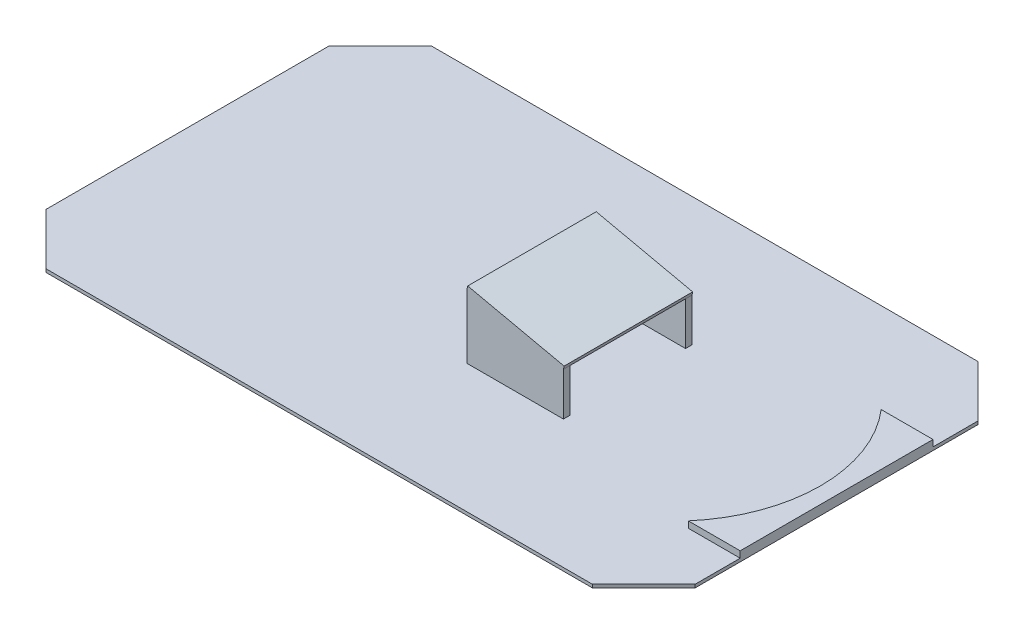
ISO-10303-21;
HEADER;
FILE_DESCRIPTION(('STEP AP214'),'2;1');
FILE_NAME('part.step','',(''),(''),'','','');
FILE_SCHEMA(('AUTOMOTIVE_DESIGN { 1 0 10303 214 1 1 1 1 }'));
ENDSEC;
DATA;
#1=APPLICATION_CONTEXT('core data for automotive mechanical design processes');
#2=APPLICATION_PROTOCOL_DEFINITION('international standard','automotive_design',2000,#1);
#3=PRODUCT_CONTEXT('',#1,'mechanical');
#4=PRODUCT('Part','Part','',(#3));
#5=PRODUCT_RELATED_PRODUCT_CATEGORY('part','',(#4));
#6=PRODUCT_DEFINITION_FORMATION('','',#4);
#7=PRODUCT_DEFINITION_CONTEXT('part definition',#1,'design');
#8=PRODUCT_DEFINITION('design','',#6,#7);
#9=PRODUCT_DEFINITION_SHAPE('','',#8);
#10=(LENGTH_UNIT() NAMED_UNIT(*) SI_UNIT(.MILLI.,.METRE.));
#11=(NAMED_UNIT(*) PLANE_ANGLE_UNIT() SI_UNIT($,.RADIAN.));
#12=(NAMED_UNIT(*) SI_UNIT($,.STERADIAN.) SOLID_ANGLE_UNIT());
#13=UNCERTAINTY_MEASURE_WITH_UNIT(LENGTH_MEASURE(1.E-05),#10,'distance_accuracy_value','');
#14=(GEOMETRIC_REPRESENTATION_CONTEXT(3) GLOBAL_UNCERTAINTY_ASSIGNED_CONTEXT((#13)) GLOBAL_UNIT_ASSIGNED_CONTEXT((#10,
#11,#12)) REPRESENTATION_CONTEXT('',''));
#15=CARTESIAN_POINT('',(0.,0.,0.));
#16=DIRECTION('',(0.,0.,1.));
#17=DIRECTION('',(1.,0.,0.));
#18=AXIS2_PLACEMENT_3D('',#15,#16,#17);
#19=CARTESIAN_POINT('',(0.,5.,0.));
#20=DIRECTION('',(0.,-1.,0.));
#21=DIRECTION('',(0.,0.,-1.));
#22=AXIS2_PLACEMENT_3D('',#19,#20,#21);
#23=PLANE('',#22);
#24=DIRECTION('',(-1.,0.,0.));
#25=VECTOR('',#24,1.);
#26=CARTESIAN_POINT('',(100.,5.,-100.));
#27=LINE('',#26,#25);
#28=CARTESIAN_POINT('',(180.,5.,-100.));
#29=VERTEX_POINT('',#28);
#30=CARTESIAN_POINT('',(30.,5.,-100.));
#31=VERTEX_POINT('',#30);
#32=EDGE_CURVE('E316',#29,#31,#27,.T.);
#33=ORIENTED_EDGE('',*,*,#32,.F.);
#34=DIRECTION('',(0.,0.,-1.));
#35=VECTOR('',#34,1.);
#36=CARTESIAN_POINT('',(180.,5.,-100.));
#37=LINE('',#36,#35);
#38=CARTESIAN_POINT('',(180.,5.,-90.));
#39=VERTEX_POINT('',#38);
#40=EDGE_CURVE('E320',#39,#29,#37,.T.);
#41=ORIENTED_EDGE('',*,*,#40,.F.);
#42=DIRECTION('',(1.,0.,0.));
#43=VECTOR('',#42,1.);
#44=CARTESIAN_POINT('',(180.,5.,-90.));
#45=LINE('',#44,#43);
#46=CARTESIAN_POINT('',(30.,5.,-90.));
#47=VERTEX_POINT('',#46);
#48=EDGE_CURVE('E326',#47,#39,#45,.T.);
#49=ORIENTED_EDGE('',*,*,#48,.F.);
#50=DIRECTION('',(0.,0.,1.));
#51=VECTOR('',#50,1.);
#52=CARTESIAN_POINT('',(30.,5.,-90.));
#53=LINE('',#52,#51);
#54=EDGE_CURVE('E323',#31,#47,#53,.T.);
#55=ORIENTED_EDGE('',*,*,#54,.F.);
#56=EDGE_LOOP('',(#33,#41,#49,#55));
#57=FACE_BOUND('',#56,.T.);
#58=DIRECTION('',(1.,0.,0.));
#59=VECTOR('',#58,1.);
#60=CARTESIAN_POINT('',(90.,5.,10.));
#61=LINE('',#60,#59);
#62=CARTESIAN_POINT('',(90.,5.,10.));
#63=VERTEX_POINT('',#62);
#64=CARTESIAN_POINT('',(110.,5.,10.));
#65=VERTEX_POINT('',#64);
#66=EDGE_CURVE('E430',#63,#65,#61,.T.);
#67=ORIENTED_EDGE('',*,*,#66,.F.);
#68=DIRECTION('',(0.,0.,1.));
#69=VECTOR('',#68,1.);
#70=CARTESIAN_POINT('',(90.,5.,0.));
#71=LINE('',#70,#69);
#72=CARTESIAN_POINT('',(90.,5.,-10.));
#73=VERTEX_POINT('',#72);
#74=EDGE_CURVE('E435',#73,#63,#71,.T.);
#75=ORIENTED_EDGE('',*,*,#74,.F.);
#76=DIRECTION('',(-1.,0.,0.));
#77=VECTOR('',#76,1.);
#78=CARTESIAN_POINT('',(90.,5.,-10.));
#79=LINE('',#78,#77);
#80=CARTESIAN_POINT('',(110.,5.,-10.));
#81=VERTEX_POINT('',#80);
#82=EDGE_CURVE('E450',#81,#73,#79,.T.);
#83=ORIENTED_EDGE('',*,*,#82,.F.);
#84=DIRECTION('',(0.,0.,-1.));
#85=VECTOR('',#84,1.);
#86=CARTESIAN_POINT('',(110.,5.,-10.));
#87=LINE('',#86,#85);
#88=EDGE_CURVE('E447',#65,#81,#87,.T.);
#89=ORIENTED_EDGE('',*,*,#88,.F.);
#90=EDGE_LOOP('',(#67,#75,#83,#89));
#91=FACE_BOUND('',#90,.T.);
#92=DIRECTION('',(-1.,0.,0.));
#93=VECTOR('',#92,1.);
#94=CARTESIAN_POINT('',(424.355957741627,5.,-150.));
#95=LINE('',#94,#93);
#96=CARTESIAN_POINT('',(505.,5.,-150.));
#97=VERTEX_POINT('',#96);
#98=CARTESIAN_POINT('',(424.355957741627,5.,-150.));
#99=VERTEX_POINT('',#98);
#100=EDGE_CURVE('E340',#97,#99,#95,.T.);
#101=ORIENTED_EDGE('',*,*,#100,.F.);
#102=DIRECTION('',(0.,0.,-1.));
#103=VECTOR('',#102,1.);
#104=CARTESIAN_POINT('',(505.,5.,9.99999999999549));
#105=LINE('',#104,#103);
#106=CARTESIAN_POINT('',(505.,5.,-220.));
#107=VERTEX_POINT('',#106);
#108=EDGE_CURVE('E483',#97,#107,#105,.T.);
#109=ORIENTED_EDGE('',*,*,#108,.T.);
#110=DIRECTION('',(-0.707106781186548,0.,-0.707106781186548));
#111=VECTOR('',#110,1.);
#112=CARTESIAN_POINT('',(425.,5.,-300.));
#113=LINE('',#112,#111);
#114=CARTESIAN_POINT('',(425.,5.,-300.));
#115=VERTEX_POINT('',#114);
#116=EDGE_CURVE('E467',#107,#115,#113,.T.);
#117=ORIENTED_EDGE('',*,*,#116,.T.);
#118=DIRECTION('',(-1.,0.,0.));
#119=VECTOR('',#118,1.);
#120=CARTESIAN_POINT('',(-425.,5.,-300.));
#121=LINE('',#120,#119);
#122=CARTESIAN_POINT('',(-425.,5.,-300.));
#123=VERTEX_POINT('',#122);
#124=EDGE_CURVE('E470',#115,#123,#121,.T.);
#125=ORIENTED_EDGE('',*,*,#124,.T.);
#126=DIRECTION('',(-0.707106781186548,0.,0.707106781186547));
#127=VECTOR('',#126,1.);
#128=CARTESIAN_POINT('',(-505.,5.,-220.));
#129=LINE('',#128,#127);
#130=CARTESIAN_POINT('',(-505.,5.,-220.));
#131=VERTEX_POINT('',#130);
#132=EDGE_CURVE('E473',#123,#131,#129,.T.);
#133=ORIENTED_EDGE('',*,*,#132,.T.);
#134=DIRECTION('',(0.,0.,1.));
#135=VECTOR('',#134,1.);
#136=CARTESIAN_POINT('',(-505.,5.,50.));
#137=LINE('',#136,#135);
#138=CARTESIAN_POINT('',(-505.,5.,220.));
#139=VERTEX_POINT('',#138);
#140=EDGE_CURVE('E475',#131,#139,#137,.T.);
#141=ORIENTED_EDGE('',*,*,#140,.T.);
#142=DIRECTION('',(0.707106781186548,0.,0.707106781186547));
#143=VECTOR('',#142,1.);
#144=CARTESIAN_POINT('',(-505.,5.,220.));
#145=LINE('',#144,#143);
#146=CARTESIAN_POINT('',(-425.,5.,300.));
#147=VERTEX_POINT('',#146);
#148=EDGE_CURVE('E477',#139,#147,#145,.T.);
#149=ORIENTED_EDGE('',*,*,#148,.T.);
#150=DIRECTION('',(1.,0.,0.));
#151=VECTOR('',#150,1.);
#152=CARTESIAN_POINT('',(425.,5.,300.));
#153=LINE('',#152,#151);
#154=CARTESIAN_POINT('',(425.,5.,300.));
#155=VERTEX_POINT('',#154);
#156=EDGE_CURVE('E479',#147,#155,#153,.T.);
#157=ORIENTED_EDGE('',*,*,#156,.T.);
#158=DIRECTION('',(0.707106781186546,0.,-0.707106781186548));
#159=VECTOR('',#158,1.);
#160=CARTESIAN_POINT('',(505.,5.,220.));
#161=LINE('',#160,#159);
#162=CARTESIAN_POINT('',(505.,5.,220.));
#163=VERTEX_POINT('',#162);
#164=EDGE_CURVE('E481',#155,#163,#161,.T.);
#165=ORIENTED_EDGE('',*,*,#164,.T.);
#166=CARTESIAN_POINT('',(505.,5.,150.));
#167=VERTEX_POINT('',#166);
#168=EDGE_CURVE('E484',#163,#167,#105,.T.);
#169=ORIENTED_EDGE('',*,*,#168,.T.);
#170=DIRECTION('',(1.,0.,0.));
#171=VECTOR('',#170,1.);
#172=CARTESIAN_POINT('',(424.355957741627,5.,150.));
#173=LINE('',#172,#171);
#174=CARTESIAN_POINT('',(424.355957741627,5.,150.));
#175=VERTEX_POINT('',#174);
#176=EDGE_CURVE('E344',#175,#167,#173,.T.);
#177=ORIENTED_EDGE('',*,*,#176,.F.);
#178=CARTESIAN_POINT('',(250.,5.,0.));
#179=DIRECTION('',(0.,-1.,0.));
#180=DIRECTION('',(0.,0.,1.));
#181=AXIS2_PLACEMENT_3D('',#178,#179,#180);
#182=CIRCLE('',#181,230.);
#183=EDGE_CURVE('E353',#99,#175,#182,.T.);
#184=ORIENTED_EDGE('',*,*,#183,.F.);
#185=EDGE_LOOP('',(#101,#109,#117,#125,#133,#141,#149,#157,#165,#169,#177,#184));
#186=FACE_BOUND('',#185,.T.);
#187=DIRECTION('',(-1.,0.,0.));
#188=VECTOR('',#187,1.);
#189=CARTESIAN_POINT('',(30.,5.,90.));
#190=LINE('',#189,#188);
#191=CARTESIAN_POINT('',(180.,5.,90.));
#192=VERTEX_POINT('',#191);
#193=CARTESIAN_POINT('',(30.,5.,90.));
#194=VERTEX_POINT('',#193);
#195=EDGE_CURVE('E299',#192,#194,#190,.T.);
#196=ORIENTED_EDGE('',*,*,#195,.F.);
#197=DIRECTION('',(0.,0.,-1.));
#198=VECTOR('',#197,1.);
#199=CARTESIAN_POINT('',(180.,5.,90.));
#200=LINE('',#199,#198);
#201=CARTESIAN_POINT('',(180.,5.,100.));
#202=VERTEX_POINT('',#201);
#203=EDGE_CURVE('E302',#202,#192,#200,.T.);
#204=ORIENTED_EDGE('',*,*,#203,.F.);
#205=DIRECTION('',(1.,0.,0.));
#206=VECTOR('',#205,1.);
#207=CARTESIAN_POINT('',(180.,5.,100.));
#208=LINE('',#207,#206);
#209=CARTESIAN_POINT('',(30.,5.,100.));
#210=VERTEX_POINT('',#209);
#211=EDGE_CURVE('E56',#210,#202,#208,.T.);
#212=ORIENTED_EDGE('',*,*,#211,.F.);
#213=DIRECTION('',(0.,0.,1.));
#214=VECTOR('',#213,1.);
#215=CARTESIAN_POINT('',(30.,5.,90.));
#216=LINE('',#215,#214);
#217=EDGE_CURVE('E51',#194,#210,#216,.T.);
#218=ORIENTED_EDGE('',*,*,#217,.F.);
#219=EDGE_LOOP('',(#196,#204,#212,#218));
#220=FACE_BOUND('',#219,.T.);
#221=ADVANCED_FACE('F36',(#57,#91,#186,#220),#23,.F.);
#222=CARTESIAN_POINT('',(425.,5.,-300.));
#223=DIRECTION('',(-0.707106781186548,0.,0.707106781186548));
#224=DIRECTION('',(0.707106781186548,0.,0.707106781186548));
#225=AXIS2_PLACEMENT_3D('',#222,#223,#224);
#226=PLANE('',#225);
#227=DIRECTION('',(-0.707106781186548,0.,-0.707106781186548));
#228=VECTOR('',#227,1.);
#229=CARTESIAN_POINT('',(425.,0.,-300.));
#230=LINE('',#229,#228);
#231=CARTESIAN_POINT('',(505.,0.,-220.));
#232=VERTEX_POINT('',#231);
#233=CARTESIAN_POINT('',(425.,0.,-300.));
#234=VERTEX_POINT('',#233);
#235=EDGE_CURVE('E466',#232,#234,#230,.T.);
#236=ORIENTED_EDGE('',*,*,#235,.T.);
#237=DIRECTION('',(0.,-1.,0.));
#238=VECTOR('',#237,1.);
#239=CARTESIAN_POINT('',(425.,5.,-300.));
#240=LINE('',#239,#238);
#241=EDGE_CURVE('E11',#115,#234,#240,.T.);
#242=ORIENTED_EDGE('',*,*,#241,.F.);
#243=ORIENTED_EDGE('',*,*,#116,.F.);
#244=DIRECTION('',(0.,-1.,0.));
#245=VECTOR('',#244,1.);
#246=CARTESIAN_POINT('',(505.,5.,-220.));
#247=LINE('',#246,#245);
#248=EDGE_CURVE('E486',#107,#232,#247,.T.);
#249=ORIENTED_EDGE('',*,*,#248,.T.);
#250=EDGE_LOOP('',(#236,#242,#243,#249));
#251=FACE_BOUND('',#250,.T.);
#252=ADVANCED_FACE('F38',(#251),#226,.F.);
#253=CARTESIAN_POINT('',(-425.,5.,-300.));
#254=DIRECTION('',(0.,0.,1.));
#255=DIRECTION('',(1.,0.,0.));
#256=AXIS2_PLACEMENT_3D('',#253,#254,#255);
#257=PLANE('',#256);
#258=DIRECTION('',(-1.,0.,0.));
#259=VECTOR('',#258,1.);
#260=CARTESIAN_POINT('',(-425.,0.,-300.));
#261=LINE('',#260,#259);
#262=CARTESIAN_POINT('',(-425.,0.,-300.));
#263=VERTEX_POINT('',#262);
#264=EDGE_CURVE('E489',#234,#263,#261,.T.);
#265=ORIENTED_EDGE('',*,*,#264,.T.);
#266=DIRECTION('',(0.,-1.,0.));
#267=VECTOR('',#266,1.);
#268=CARTESIAN_POINT('',(-425.,5.,-300.));
#269=LINE('',#268,#267);
#270=EDGE_CURVE('E44',#123,#263,#269,.T.);
#271=ORIENTED_EDGE('',*,*,#270,.F.);
#272=ORIENTED_EDGE('',*,*,#124,.F.);
#273=ORIENTED_EDGE('',*,*,#241,.T.);
#274=EDGE_LOOP('',(#265,#271,#272,#273));
#275=FACE_BOUND('',#274,.T.);
#276=ADVANCED_FACE('F547',(#275),#257,.F.);
#277=CARTESIAN_POINT('',(-505.,5.,-220.));
#278=DIRECTION('',(0.707106781186547,0.,0.707106781186548));
#279=DIRECTION('',(0.707106781186548,0.,-0.707106781186547));
#280=AXIS2_PLACEMENT_3D('',#277,#278,#279);
#281=PLANE('',#280);
#282=DIRECTION('',(-0.707106781186548,0.,0.707106781186547));
#283=VECTOR('',#282,1.);
#284=CARTESIAN_POINT('',(-505.,0.,-220.));
#285=LINE('',#284,#283);
#286=CARTESIAN_POINT('',(-505.,0.,-220.));
#287=VERTEX_POINT('',#286);
#288=EDGE_CURVE('E491',#263,#287,#285,.T.);
#289=ORIENTED_EDGE('',*,*,#288,.T.);
#290=DIRECTION('',(0.,-1.,0.));
#291=VECTOR('',#290,1.);
#292=CARTESIAN_POINT('',(-505.,5.,-220.));
#293=LINE('',#292,#291);
#294=EDGE_CURVE('E518',#131,#287,#293,.T.);
#295=ORIENTED_EDGE('',*,*,#294,.F.);
#296=ORIENTED_EDGE('',*,*,#132,.F.);
#297=ORIENTED_EDGE('',*,*,#270,.T.);
#298=EDGE_LOOP('',(#289,#295,#296,#297));
#299=FACE_BOUND('',#298,.T.);
#300=ADVANCED_FACE('F525',(#299),#281,.F.);
#301=CARTESIAN_POINT('',(-505.,5.,50.));
#302=DIRECTION('',(1.,0.,0.));
#303=DIRECTION('',(0.,0.,-1.));
#304=AXIS2_PLACEMENT_3D('',#301,#302,#303);
#305=PLANE('',#304);
#306=DIRECTION('',(0.,0.,1.));
#307=VECTOR('',#306,1.);
#308=CARTESIAN_POINT('',(-505.,0.,50.));
#309=LINE('',#308,#307);
#310=CARTESIAN_POINT('',(-505.,0.,220.));
#311=VERTEX_POINT('',#310);
#312=EDGE_CURVE('E494',#287,#311,#309,.T.);
#313=ORIENTED_EDGE('',*,*,#312,.T.);
#314=DIRECTION('',(0.,-1.,0.));
#315=VECTOR('',#314,1.);
#316=CARTESIAN_POINT('',(-505.,5.,220.));
#317=LINE('',#316,#315);
#318=EDGE_CURVE('E515',#139,#311,#317,.T.);
#319=ORIENTED_EDGE('',*,*,#318,.F.);
#320=ORIENTED_EDGE('',*,*,#140,.F.);
#321=ORIENTED_EDGE('',*,*,#294,.T.);
#322=EDGE_LOOP('',(#313,#319,#320,#321));
#323=FACE_BOUND('',#322,.T.);
#324=ADVANCED_FACE('F535',(#323),#305,.F.);
#325=CARTESIAN_POINT('',(-505.,5.,220.));
#326=DIRECTION('',(0.707106781186547,0.,-0.707106781186548));
#327=DIRECTION('',(-0.707106781186548,0.,-0.707106781186547));
#328=AXIS2_PLACEMENT_3D('',#325,#326,#327);
#329=PLANE('',#328);
#330=DIRECTION('',(0.707106781186548,0.,0.707106781186547));
#331=VECTOR('',#330,1.);
#332=CARTESIAN_POINT('',(-505.,0.,220.));
#333=LINE('',#332,#331);
#334=CARTESIAN_POINT('',(-425.,0.,300.));
#335=VERTEX_POINT('',#334);
#336=EDGE_CURVE('E496',#311,#335,#333,.T.);
#337=ORIENTED_EDGE('',*,*,#336,.T.);
#338=DIRECTION('',(0.,-1.,0.));
#339=VECTOR('',#338,1.);
#340=CARTESIAN_POINT('',(-425.,5.,300.));
#341=LINE('',#340,#339);
#342=EDGE_CURVE('E512',#147,#335,#341,.T.);
#343=ORIENTED_EDGE('',*,*,#342,.F.);
#344=ORIENTED_EDGE('',*,*,#148,.F.);
#345=ORIENTED_EDGE('',*,*,#318,.T.);
#346=EDGE_LOOP('',(#337,#343,#344,#345));
#347=FACE_BOUND('',#346,.T.);
#348=ADVANCED_FACE('F539',(#347),#329,.F.);
#349=CARTESIAN_POINT('',(425.,5.,300.));
#350=DIRECTION('',(0.,0.,-1.));
#351=DIRECTION('',(-1.,0.,0.));
#352=AXIS2_PLACEMENT_3D('',#349,#350,#351);
#353=PLANE('',#352);
#354=DIRECTION('',(1.,0.,0.));
#355=VECTOR('',#354,1.);
#356=CARTESIAN_POINT('',(425.,0.,300.));
#357=LINE('',#356,#355);
#358=CARTESIAN_POINT('',(425.,0.,300.));
#359=VERTEX_POINT('',#358);
#360=EDGE_CURVE('E498',#335,#359,#357,.T.);
#361=ORIENTED_EDGE('',*,*,#360,.T.);
#362=DIRECTION('',(0.,-1.,0.));
#363=VECTOR('',#362,1.);
#364=CARTESIAN_POINT('',(425.,5.,300.));
#365=LINE('',#364,#363);
#366=EDGE_CURVE('E509',#155,#359,#365,.T.);
#367=ORIENTED_EDGE('',*,*,#366,.F.);
#368=ORIENTED_EDGE('',*,*,#156,.F.);
#369=ORIENTED_EDGE('',*,*,#342,.T.);
#370=EDGE_LOOP('',(#361,#367,#368,#369));
#371=FACE_BOUND('',#370,.T.);
#372=ADVANCED_FACE('F603',(#371),#353,.F.);
#373=CARTESIAN_POINT('',(505.,5.,220.));
#374=DIRECTION('',(-0.707106781186548,0.,-0.707106781186546));
#375=DIRECTION('',(-0.707106781186547,0.,0.707106781186549));
#376=AXIS2_PLACEMENT_3D('',#373,#374,#375);
#377=PLANE('',#376);
#378=DIRECTION('',(0.707106781186546,0.,-0.707106781186548));
#379=VECTOR('',#378,1.);
#380=CARTESIAN_POINT('',(505.,0.,220.));
#381=LINE('',#380,#379);
#382=CARTESIAN_POINT('',(505.,0.,220.));
#383=VERTEX_POINT('',#382);
#384=EDGE_CURVE('E500',#359,#383,#381,.T.);
#385=ORIENTED_EDGE('',*,*,#384,.T.);
#386=DIRECTION('',(0.,-1.,0.));
#387=VECTOR('',#386,1.);
#388=CARTESIAN_POINT('',(505.,5.,220.));
#389=LINE('',#388,#387);
#390=EDGE_CURVE('E506',#163,#383,#389,.T.);
#391=ORIENTED_EDGE('',*,*,#390,.F.);
#392=ORIENTED_EDGE('',*,*,#164,.F.);
#393=ORIENTED_EDGE('',*,*,#366,.T.);
#394=EDGE_LOOP('',(#385,#391,#392,#393));
#395=FACE_BOUND('',#394,.T.);
#396=ADVANCED_FACE('F554',(#395),#377,.F.);
#397=CARTESIAN_POINT('',(505.,5.,-220.));
#398=DIRECTION('',(-1.,0.,0.));
#399=DIRECTION('',(0.,0.,1.));
#400=AXIS2_PLACEMENT_3D('',#397,#398,#399);
#401=PLANE('',#400);
#402=DIRECTION('',(0.,0.,-1.));
#403=VECTOR('',#402,1.);
#404=CARTESIAN_POINT('',(505.,0.,-220.));
#405=LINE('',#404,#403);
#406=EDGE_CURVE('E471',#383,#232,#405,.T.);
#407=ORIENTED_EDGE('',*,*,#406,.T.);
#408=ORIENTED_EDGE('',*,*,#248,.F.);
#409=ORIENTED_EDGE('',*,*,#108,.F.);
#410=DIRECTION('',(0.,-1.,0.));
#411=VECTOR('',#410,1.);
#412=CARTESIAN_POINT('',(505.,15.,-150.));
#413=LINE('',#412,#411);
#414=CARTESIAN_POINT('',(505.,15.,-150.));
#415=VERTEX_POINT('',#414);
#416=EDGE_CURVE('E366',#415,#97,#413,.T.);
#417=ORIENTED_EDGE('',*,*,#416,.F.);
#418=DIRECTION('',(0.,0.,-1.));
#419=VECTOR('',#418,1.);
#420=CARTESIAN_POINT('',(505.,15.,0.));
#421=LINE('',#420,#419);
#422=CARTESIAN_POINT('',(505.,15.,150.));
#423=VERTEX_POINT('',#422);
#424=EDGE_CURVE('E341',#423,#415,#421,.T.);
#425=ORIENTED_EDGE('',*,*,#424,.F.);
#426=DIRECTION('',(0.,-1.,0.));
#427=VECTOR('',#426,1.);
#428=CARTESIAN_POINT('',(505.,15.,150.));
#429=LINE('',#428,#427);
#430=EDGE_CURVE('E350',#423,#167,#429,.T.);
#431=ORIENTED_EDGE('',*,*,#430,.T.);
#432=ORIENTED_EDGE('',*,*,#168,.F.);
#433=ORIENTED_EDGE('',*,*,#390,.T.);
#434=EDGE_LOOP('',(#407,#408,#409,#417,#425,#431,#432,#433));
#435=FACE_BOUND('',#434,.T.);
#436=ADVANCED_FACE('F557',(#435),#401,.F.);
#437=CARTESIAN_POINT('',(0.,0.,0.));
#438=DIRECTION('',(0.,-1.,0.));
#439=DIRECTION('',(0.,0.,-1.));
#440=AXIS2_PLACEMENT_3D('',#437,#438,#439);
#441=PLANE('',#440);
#442=ORIENTED_EDGE('',*,*,#235,.F.);
#443=ORIENTED_EDGE('',*,*,#406,.F.);
#444=ORIENTED_EDGE('',*,*,#384,.F.);
#445=ORIENTED_EDGE('',*,*,#360,.F.);
#446=ORIENTED_EDGE('',*,*,#336,.F.);
#447=ORIENTED_EDGE('',*,*,#312,.F.);
#448=ORIENTED_EDGE('',*,*,#288,.F.);
#449=ORIENTED_EDGE('',*,*,#264,.F.);
#450=EDGE_LOOP('',(#442,#443,#444,#445,#446,#447,#448,#449));
#451=FACE_BOUND('',#450,.T.);
#452=ADVANCED_FACE('F530',(#451),#441,.T.);
#453=CARTESIAN_POINT('',(90.,35.,10.));
#454=DIRECTION('',(0.,0.,-1.));
#455=DIRECTION('',(-1.,0.,0.));
#456=AXIS2_PLACEMENT_3D('',#453,#454,#455);
#457=PLANE('',#456);
#458=ORIENTED_EDGE('',*,*,#66,.T.);
#459=DIRECTION('',(0.,-1.,0.));
#460=VECTOR('',#459,1.);
#461=CARTESIAN_POINT('',(110.,35.,10.));
#462=LINE('',#461,#460);
#463=CARTESIAN_POINT('',(110.,35.,10.));
#464=VERTEX_POINT('',#463);
#465=EDGE_CURVE('E463',#464,#65,#462,.T.);
#466=ORIENTED_EDGE('',*,*,#465,.F.);
#467=DIRECTION('',(1.,0.,0.));
#468=VECTOR('',#467,1.);
#469=CARTESIAN_POINT('',(90.,35.,10.));
#470=LINE('',#469,#468);
#471=CARTESIAN_POINT('',(90.,35.,10.));
#472=VERTEX_POINT('',#471);
#473=EDGE_CURVE('E431',#472,#464,#470,.T.);
#474=ORIENTED_EDGE('',*,*,#473,.F.);
#475=DIRECTION('',(0.,-1.,0.));
#476=VECTOR('',#475,1.);
#477=CARTESIAN_POINT('',(90.,35.,10.));
#478=LINE('',#477,#476);
#479=EDGE_CURVE('E444',#472,#63,#478,.T.);
#480=ORIENTED_EDGE('',*,*,#479,.T.);
#481=EDGE_LOOP('',(#458,#466,#474,#480));
#482=FACE_BOUND('',#481,.T.);
#483=ADVANCED_FACE('F595',(#482),#457,.F.);
#484=CARTESIAN_POINT('',(110.,35.,-10.));
#485=DIRECTION('',(-1.,0.,0.));
#486=DIRECTION('',(0.,0.,1.));
#487=AXIS2_PLACEMENT_3D('',#484,#485,#486);
#488=PLANE('',#487);
#489=ORIENTED_EDGE('',*,*,#88,.T.);
#490=DIRECTION('',(0.,-1.,0.));
#491=VECTOR('',#490,1.);
#492=CARTESIAN_POINT('',(110.,35.,-10.));
#493=LINE('',#492,#491);
#494=CARTESIAN_POINT('',(110.,35.,-10.));
#495=VERTEX_POINT('',#494);
#496=EDGE_CURVE('E460',#495,#81,#493,.T.);
#497=ORIENTED_EDGE('',*,*,#496,.F.);
#498=DIRECTION('',(0.,0.,-1.));
#499=VECTOR('',#498,1.);
#500=CARTESIAN_POINT('',(110.,35.,-10.));
#501=LINE('',#500,#499);
#502=EDGE_CURVE('E434',#464,#495,#501,.T.);
#503=ORIENTED_EDGE('',*,*,#502,.F.);
#504=ORIENTED_EDGE('',*,*,#465,.T.);
#505=EDGE_LOOP('',(#489,#497,#503,#504));
#506=FACE_BOUND('',#505,.T.);
#507=ADVANCED_FACE('F654',(#506),#488,.F.);
#508=CARTESIAN_POINT('',(90.,35.,-10.));
#509=DIRECTION('',(0.,0.,1.));
#510=DIRECTION('',(1.,0.,0.));
#511=AXIS2_PLACEMENT_3D('',#508,#509,#510);
#512=PLANE('',#511);
#513=ORIENTED_EDGE('',*,*,#82,.T.);
#514=DIRECTION('',(0.,-1.,0.));
#515=VECTOR('',#514,1.);
#516=CARTESIAN_POINT('',(90.,35.,-10.));
#517=LINE('',#516,#515);
#518=CARTESIAN_POINT('',(90.,35.,-10.));
#519=VERTEX_POINT('',#518);
#520=EDGE_CURVE('E457',#519,#73,#517,.T.);
#521=ORIENTED_EDGE('',*,*,#520,.F.);
#522=DIRECTION('',(-1.,0.,0.));
#523=VECTOR('',#522,1.);
#524=CARTESIAN_POINT('',(90.,35.,-10.));
#525=LINE('',#524,#523);
#526=EDGE_CURVE('E438',#495,#519,#525,.T.);
#527=ORIENTED_EDGE('',*,*,#526,.F.);
#528=ORIENTED_EDGE('',*,*,#496,.T.);
#529=EDGE_LOOP('',(#513,#521,#527,#528));
#530=FACE_BOUND('',#529,.T.);
#531=ADVANCED_FACE('F661',(#530),#512,.F.);
#532=CARTESIAN_POINT('',(90.,35.,0.));
#533=DIRECTION('',(1.,0.,0.));
#534=DIRECTION('',(0.,0.,-1.));
#535=AXIS2_PLACEMENT_3D('',#532,#533,#534);
#536=PLANE('',#535);
#537=ORIENTED_EDGE('',*,*,#74,.T.);
#538=ORIENTED_EDGE('',*,*,#479,.F.);
#539=DIRECTION('',(0.,0.,1.));
#540=VECTOR('',#539,1.);
#541=CARTESIAN_POINT('',(90.,35.,0.));
#542=LINE('',#541,#540);
#543=EDGE_CURVE('E441',#519,#472,#542,.T.);
#544=ORIENTED_EDGE('',*,*,#543,.F.);
#545=ORIENTED_EDGE('',*,*,#520,.T.);
#546=EDGE_LOOP('',(#537,#538,#544,#545));
#547=FACE_BOUND('',#546,.T.);
#548=ADVANCED_FACE('F669',(#547),#536,.F.);
#549=CARTESIAN_POINT('',(0.,35.,0.));
#550=DIRECTION('',(0.,1.,0.));
#551=DIRECTION('',(0.,0.,1.));
#552=AXIS2_PLACEMENT_3D('',#549,#550,#551);
#553=PLANE('',#552);
#554=DIRECTION('',(1.,0.,0.));
#555=VECTOR('',#554,1.);
#556=CARTESIAN_POINT('',(100.,35.,25.));
#557=LINE('',#556,#555);
#558=CARTESIAN_POINT('',(75.,35.,25.));
#559=VERTEX_POINT('',#558);
#560=CARTESIAN_POINT('',(125.,35.,25.));
#561=VERTEX_POINT('',#560);
#562=EDGE_CURVE('E396',#559,#561,#557,.T.);
#563=ORIENTED_EDGE('',*,*,#562,.F.);
#564=DIRECTION('',(0.,0.,1.));
#565=VECTOR('',#564,1.);
#566=CARTESIAN_POINT('',(75.,35.,-25.));
#567=LINE('',#566,#565);
#568=CARTESIAN_POINT('',(75.,35.,-25.));
#569=VERTEX_POINT('',#568);
#570=EDGE_CURVE('E405',#569,#559,#567,.T.);
#571=ORIENTED_EDGE('',*,*,#570,.F.);
#572=DIRECTION('',(-1.,0.,0.));
#573=VECTOR('',#572,1.);
#574=CARTESIAN_POINT('',(125.,35.,-25.));
#575=LINE('',#574,#573);
#576=CARTESIAN_POINT('',(125.,35.,-25.));
#577=VERTEX_POINT('',#576);
#578=EDGE_CURVE('E415',#577,#569,#575,.T.);
#579=ORIENTED_EDGE('',*,*,#578,.F.);
#580=DIRECTION('',(0.,0.,-1.));
#581=VECTOR('',#580,1.);
#582=CARTESIAN_POINT('',(125.,35.,25.));
#583=LINE('',#582,#581);
#584=EDGE_CURVE('E413',#561,#577,#583,.T.);
#585=ORIENTED_EDGE('',*,*,#584,.F.);
#586=EDGE_LOOP('',(#563,#571,#579,#585));
#587=FACE_BOUND('',#586,.T.);
#588=ORIENTED_EDGE('',*,*,#543,.T.);
#589=ORIENTED_EDGE('',*,*,#473,.T.);
#590=ORIENTED_EDGE('',*,*,#502,.T.);
#591=ORIENTED_EDGE('',*,*,#526,.T.);
#592=EDGE_LOOP('',(#588,#589,#590,#591));
#593=FACE_BOUND('',#592,.T.);
#594=ADVANCED_FACE('F677',(#587,#593),#553,.F.);
#595=CARTESIAN_POINT('',(100.,65.,25.));
#596=DIRECTION('',(0.,0.,-1.));
#597=DIRECTION('',(-1.,0.,0.));
#598=AXIS2_PLACEMENT_3D('',#595,#596,#597);
#599=PLANE('',#598);
#600=ORIENTED_EDGE('',*,*,#562,.T.);
#601=DIRECTION('',(0.,-1.,0.));
#602=VECTOR('',#601,1.);
#603=CARTESIAN_POINT('',(125.,65.,25.));
#604=LINE('',#603,#602);
#605=CARTESIAN_POINT('',(125.,65.,25.));
#606=VERTEX_POINT('',#605);
#607=EDGE_CURVE('E427',#606,#561,#604,.T.);
#608=ORIENTED_EDGE('',*,*,#607,.F.);
#609=DIRECTION('',(1.,0.,0.));
#610=VECTOR('',#609,1.);
#611=CARTESIAN_POINT('',(75.,65.,25.));
#612=LINE('',#611,#610);
#613=CARTESIAN_POINT('',(75.,65.,25.));
#614=VERTEX_POINT('',#613);
#615=EDGE_CURVE('E402',#614,#606,#612,.T.);
#616=ORIENTED_EDGE('',*,*,#615,.F.);
#617=DIRECTION('',(0.,-1.,0.));
#618=VECTOR('',#617,1.);
#619=CARTESIAN_POINT('',(75.,65.,25.));
#620=LINE('',#619,#618);
#621=EDGE_CURVE('E411',#614,#559,#620,.T.);
#622=ORIENTED_EDGE('',*,*,#621,.T.);
#623=EDGE_LOOP('',(#600,#608,#616,#622));
#624=FACE_BOUND('',#623,.T.);
#625=ADVANCED_FACE('F685',(#624),#599,.F.);
#626=CARTESIAN_POINT('',(125.,65.,25.));
#627=DIRECTION('',(-1.,0.,0.));
#628=DIRECTION('',(0.,0.,1.));
#629=AXIS2_PLACEMENT_3D('',#626,#627,#628);
#630=PLANE('',#629);
#631=DIRECTION('',(0.,0.,1.));
#632=VECTOR('',#631,1.);
#633=CARTESIAN_POINT('',(125.,57.5,0.));
#634=LINE('',#633,#632);
#635=CARTESIAN_POINT('',(125.,57.5,-7.5));
#636=VERTEX_POINT('',#635);
#637=CARTESIAN_POINT('',(125.,57.5,7.5));
#638=VERTEX_POINT('',#637);
#639=EDGE_CURVE('E369',#636,#638,#634,.T.);
#640=ORIENTED_EDGE('',*,*,#639,.F.);
#641=DIRECTION('',(0.,1.,0.));
#642=VECTOR('',#641,1.);
#643=CARTESIAN_POINT('',(125.,42.5,-7.5));
#644=LINE('',#643,#642);
#645=CARTESIAN_POINT('',(125.,42.5,-7.5));
#646=VERTEX_POINT('',#645);
#647=EDGE_CURVE('E374',#646,#636,#644,.T.);
#648=ORIENTED_EDGE('',*,*,#647,.F.);
#649=DIRECTION('',(0.,0.,-1.));
#650=VECTOR('',#649,1.);
#651=CARTESIAN_POINT('',(125.,42.5,7.5));
#652=LINE('',#651,#650);
#653=CARTESIAN_POINT('',(125.,42.5,7.5));
#654=VERTEX_POINT('',#653);
#655=EDGE_CURVE('E389',#654,#646,#652,.T.);
#656=ORIENTED_EDGE('',*,*,#655,.F.);
#657=DIRECTION('',(0.,-1.,0.));
#658=VECTOR('',#657,1.);
#659=CARTESIAN_POINT('',(125.,57.5,7.5));
#660=LINE('',#659,#658);
#661=EDGE_CURVE('E386',#638,#654,#660,.T.);
#662=ORIENTED_EDGE('',*,*,#661,.F.);
#663=EDGE_LOOP('',(#640,#648,#656,#662));
#664=FACE_BOUND('',#663,.T.);
#665=ORIENTED_EDGE('',*,*,#584,.T.);
#666=DIRECTION('',(0.,-1.,0.));
#667=VECTOR('',#666,1.);
#668=CARTESIAN_POINT('',(125.,65.,-25.));
#669=LINE('',#668,#667);
#670=CARTESIAN_POINT('',(125.,65.,-25.));
#671=VERTEX_POINT('',#670);
#672=EDGE_CURVE('E424',#671,#577,#669,.T.);
#673=ORIENTED_EDGE('',*,*,#672,.F.);
#674=DIRECTION('',(0.,0.,-1.));
#675=VECTOR('',#674,1.);
#676=CARTESIAN_POINT('',(125.,65.,25.));
#677=LINE('',#676,#675);
#678=EDGE_CURVE('E404',#606,#671,#677,.T.);
#679=ORIENTED_EDGE('',*,*,#678,.F.);
#680=ORIENTED_EDGE('',*,*,#607,.T.);
#681=EDGE_LOOP('',(#665,#673,#679,#680));
#682=FACE_BOUND('',#681,.T.);
#683=ADVANCED_FACE('F694',(#664,#682),#630,.F.);
#684=CARTESIAN_POINT('',(125.,65.,-25.));
#685=DIRECTION('',(0.,0.,1.));
#686=DIRECTION('',(1.,0.,0.));
#687=AXIS2_PLACEMENT_3D('',#684,#685,#686);
#688=PLANE('',#687);
#689=ORIENTED_EDGE('',*,*,#578,.T.);
#690=DIRECTION('',(0.,-1.,0.));
#691=VECTOR('',#690,1.);
#692=CARTESIAN_POINT('',(75.,65.,-25.));
#693=LINE('',#692,#691);
#694=CARTESIAN_POINT('',(75.,65.,-25.));
#695=VERTEX_POINT('',#694);
#696=EDGE_CURVE('E421',#695,#569,#693,.T.);
#697=ORIENTED_EDGE('',*,*,#696,.F.);
#698=DIRECTION('',(-1.,0.,0.));
#699=VECTOR('',#698,1.);
#700=CARTESIAN_POINT('',(125.,65.,-25.));
#701=LINE('',#700,#699);
#702=EDGE_CURVE('E407',#671,#695,#701,.T.);
#703=ORIENTED_EDGE('',*,*,#702,.F.);
#704=ORIENTED_EDGE('',*,*,#672,.T.);
#705=EDGE_LOOP('',(#689,#697,#703,#704));
#706=FACE_BOUND('',#705,.T.);
#707=ADVANCED_FACE('F702',(#706),#688,.F.);
#708=CARTESIAN_POINT('',(75.,65.,-25.));
#709=DIRECTION('',(1.,0.,0.));
#710=DIRECTION('',(0.,0.,-1.));
#711=AXIS2_PLACEMENT_3D('',#708,#709,#710);
#712=PLANE('',#711);
#713=DIRECTION('',(0.,0.,-1.));
#714=VECTOR('',#713,1.);
#715=CARTESIAN_POINT('',(75.,42.5,7.5));
#716=LINE('',#715,#714);
#717=CARTESIAN_POINT('',(75.,42.5,7.5));
#718=VERTEX_POINT('',#717);
#719=CARTESIAN_POINT('',(75.,42.5,-7.5));
#720=VERTEX_POINT('',#719);
#721=EDGE_CURVE('E377',#718,#720,#716,.T.);
#722=ORIENTED_EDGE('',*,*,#721,.T.);
#723=DIRECTION('',(0.,1.,0.));
#724=VECTOR('',#723,1.);
#725=CARTESIAN_POINT('',(75.,42.5,-7.5));
#726=LINE('',#725,#724);
#727=CARTESIAN_POINT('',(75.,57.5,-7.5));
#728=VERTEX_POINT('',#727);
#729=EDGE_CURVE('E380',#720,#728,#726,.T.);
#730=ORIENTED_EDGE('',*,*,#729,.T.);
#731=DIRECTION('',(0.,0.,1.));
#732=VECTOR('',#731,1.);
#733=CARTESIAN_POINT('',(75.,57.5,0.));
#734=LINE('',#733,#732);
#735=CARTESIAN_POINT('',(75.,57.5,7.5));
#736=VERTEX_POINT('',#735);
#737=EDGE_CURVE('E370',#728,#736,#734,.T.);
#738=ORIENTED_EDGE('',*,*,#737,.T.);
#739=DIRECTION('',(0.,-1.,0.));
#740=VECTOR('',#739,1.);
#741=CARTESIAN_POINT('',(75.,57.5,7.5));
#742=LINE('',#741,#740);
#743=EDGE_CURVE('E373',#736,#718,#742,.T.);
#744=ORIENTED_EDGE('',*,*,#743,.T.);
#745=EDGE_LOOP('',(#722,#730,#738,#744));
#746=FACE_BOUND('',#745,.T.);
#747=ORIENTED_EDGE('',*,*,#570,.T.);
#748=ORIENTED_EDGE('',*,*,#621,.F.);
#749=DIRECTION('',(0.,0.,1.));
#750=VECTOR('',#749,1.);
#751=CARTESIAN_POINT('',(75.,65.,-25.));
#752=LINE('',#751,#750);
#753=EDGE_CURVE('E409',#695,#614,#752,.T.);
#754=ORIENTED_EDGE('',*,*,#753,.F.);
#755=ORIENTED_EDGE('',*,*,#696,.T.);
#756=EDGE_LOOP('',(#747,#748,#754,#755));
#757=FACE_BOUND('',#756,.T.);
#758=ADVANCED_FACE('F709',(#746,#757),#712,.F.);
#759=CARTESIAN_POINT('',(0.,65.,0.));
#760=DIRECTION('',(0.,1.,0.));
#761=DIRECTION('',(0.,0.,1.));
#762=AXIS2_PLACEMENT_3D('',#759,#760,#761);
#763=PLANE('',#762);
#764=ORIENTED_EDGE('',*,*,#615,.T.);
#765=ORIENTED_EDGE('',*,*,#678,.T.);
#766=ORIENTED_EDGE('',*,*,#702,.T.);
#767=ORIENTED_EDGE('',*,*,#753,.T.);
#768=EDGE_LOOP('',(#764,#765,#766,#767));
#769=FACE_BOUND('',#768,.T.);
#770=ADVANCED_FACE('F716',(#769),#763,.T.);
#771=CARTESIAN_POINT('',(75.,42.5,-7.5));
#772=DIRECTION('',(0.,0.,-1.));
#773=DIRECTION('',(-1.,0.,0.));
#774=AXIS2_PLACEMENT_3D('',#771,#772,#773);
#775=PLANE('',#774);
#776=ORIENTED_EDGE('',*,*,#647,.T.);
#777=DIRECTION('',(1.,0.,0.));
#778=VECTOR('',#777,1.);
#779=CARTESIAN_POINT('',(75.,57.5,-7.5));
#780=LINE('',#779,#778);
#781=EDGE_CURVE('E393',#728,#636,#780,.T.);
#782=ORIENTED_EDGE('',*,*,#781,.F.);
#783=ORIENTED_EDGE('',*,*,#729,.F.);
#784=DIRECTION('',(1.,0.,0.));
#785=VECTOR('',#784,1.);
#786=CARTESIAN_POINT('',(75.,42.5,-7.5));
#787=LINE('',#786,#785);
#788=EDGE_CURVE('E397',#720,#646,#787,.T.);
#789=ORIENTED_EDGE('',*,*,#788,.T.);
#790=EDGE_LOOP('',(#776,#782,#783,#789));
#791=FACE_BOUND('',#790,.T.);
#792=ADVANCED_FACE('F723',(#791),#775,.F.);
#793=CARTESIAN_POINT('',(75.,42.5,7.5));
#794=DIRECTION('',(0.,-1.,0.));
#795=DIRECTION('',(0.,0.,-1.));
#796=AXIS2_PLACEMENT_3D('',#793,#794,#795);
#797=PLANE('',#796);
#798=ORIENTED_EDGE('',*,*,#655,.T.);
#799=ORIENTED_EDGE('',*,*,#788,.F.);
#800=ORIENTED_EDGE('',*,*,#721,.F.);
#801=DIRECTION('',(1.,0.,0.));
#802=VECTOR('',#801,1.);
#803=CARTESIAN_POINT('',(75.,42.5,7.5));
#804=LINE('',#803,#802);
#805=EDGE_CURVE('E399',#718,#654,#804,.T.);
#806=ORIENTED_EDGE('',*,*,#805,.T.);
#807=EDGE_LOOP('',(#798,#799,#800,#806));
#808=FACE_BOUND('',#807,.T.);
#809=ADVANCED_FACE('F731',(#808),#797,.F.);
#810=CARTESIAN_POINT('',(75.,57.5,7.5));
#811=DIRECTION('',(0.,0.,1.));
#812=DIRECTION('',(1.,0.,0.));
#813=AXIS2_PLACEMENT_3D('',#810,#811,#812);
#814=PLANE('',#813);
#815=ORIENTED_EDGE('',*,*,#661,.T.);
#816=ORIENTED_EDGE('',*,*,#805,.F.);
#817=ORIENTED_EDGE('',*,*,#743,.F.);
#818=DIRECTION('',(1.,0.,0.));
#819=VECTOR('',#818,1.);
#820=CARTESIAN_POINT('',(75.,57.5,7.5));
#821=LINE('',#820,#819);
#822=EDGE_CURVE('E383',#736,#638,#821,.T.);
#823=ORIENTED_EDGE('',*,*,#822,.T.);
#824=EDGE_LOOP('',(#815,#816,#817,#823));
#825=FACE_BOUND('',#824,.T.);
#826=ADVANCED_FACE('F739',(#825),#814,.F.);
#827=CARTESIAN_POINT('',(75.,57.5,0.));
#828=DIRECTION('',(0.,1.,0.));
#829=DIRECTION('',(0.,0.,1.));
#830=AXIS2_PLACEMENT_3D('',#827,#828,#829);
#831=PLANE('',#830);
#832=ORIENTED_EDGE('',*,*,#639,.T.);
#833=ORIENTED_EDGE('',*,*,#822,.F.);
#834=ORIENTED_EDGE('',*,*,#737,.F.);
#835=ORIENTED_EDGE('',*,*,#781,.T.);
#836=EDGE_LOOP('',(#832,#833,#834,#835));
#837=FACE_BOUND('',#836,.T.);
#838=ADVANCED_FACE('F747',(#837),#831,.F.);
#839=CARTESIAN_POINT('',(424.355957741627,15.,-150.));
#840=DIRECTION('',(0.,0.,1.));
#841=DIRECTION('',(1.,0.,0.));
#842=AXIS2_PLACEMENT_3D('',#839,#840,#841);
#843=PLANE('',#842);
#844=ORIENTED_EDGE('',*,*,#100,.T.);
#845=DIRECTION('',(0.,-1.,0.));
#846=VECTOR('',#845,1.);
#847=CARTESIAN_POINT('',(424.355957741627,15.,-150.));
#848=LINE('',#847,#846);
#849=CARTESIAN_POINT('',(424.355957741627,15.,-150.));
#850=VERTEX_POINT('',#849);
#851=EDGE_CURVE('E363',#850,#99,#848,.T.);
#852=ORIENTED_EDGE('',*,*,#851,.F.);
#853=DIRECTION('',(-1.,0.,0.));
#854=VECTOR('',#853,1.);
#855=CARTESIAN_POINT('',(424.355957741627,15.,-150.));
#856=LINE('',#855,#854);
#857=EDGE_CURVE('E343',#415,#850,#856,.T.);
#858=ORIENTED_EDGE('',*,*,#857,.F.);
#859=ORIENTED_EDGE('',*,*,#416,.T.);
#860=EDGE_LOOP('',(#844,#852,#858,#859));
#861=FACE_BOUND('',#860,.T.);
#862=ADVANCED_FACE('F569',(#861),#843,.F.);
#863=CARTESIAN_POINT('',(250.,15.,0.));
#864=DIRECTION('',(0.,-1.,0.));
#865=DIRECTION('',(0.,0.,-1.));
#866=AXIS2_PLACEMENT_3D('',#863,#864,#865);
#867=CYLINDRICAL_SURFACE('',#866,230.);
#868=ORIENTED_EDGE('',*,*,#183,.T.);
#869=DIRECTION('',(0.,-1.,0.));
#870=VECTOR('',#869,1.);
#871=CARTESIAN_POINT('',(424.355957741627,15.,150.));
#872=LINE('',#871,#870);
#873=CARTESIAN_POINT('',(424.355957741627,15.,150.));
#874=VERTEX_POINT('',#873);
#875=EDGE_CURVE('E360',#874,#175,#872,.T.);
#876=ORIENTED_EDGE('',*,*,#875,.F.);
#877=CARTESIAN_POINT('',(250.,15.,0.));
#878=DIRECTION('',(0.,-1.,0.));
#879=DIRECTION('',(0.,0.,1.));
#880=AXIS2_PLACEMENT_3D('',#877,#878,#879);
#881=CIRCLE('',#880,230.);
#882=EDGE_CURVE('E346',#850,#874,#881,.T.);
#883=ORIENTED_EDGE('',*,*,#882,.F.);
#884=ORIENTED_EDGE('',*,*,#851,.T.);
#885=EDGE_LOOP('',(#868,#876,#883,#884));
#886=FACE_BOUND('',#885,.T.);
#887=ADVANCED_FACE('F566',(#886),#867,.F.);
#888=CARTESIAN_POINT('',(424.355957741627,15.,150.));
#889=DIRECTION('',(0.,0.,-1.));
#890=DIRECTION('',(-1.,0.,0.));
#891=AXIS2_PLACEMENT_3D('',#888,#889,#890);
#892=PLANE('',#891);
#893=ORIENTED_EDGE('',*,*,#176,.T.);
#894=ORIENTED_EDGE('',*,*,#430,.F.);
#895=DIRECTION('',(1.,0.,0.));
#896=VECTOR('',#895,1.);
#897=CARTESIAN_POINT('',(424.355957741627,15.,150.));
#898=LINE('',#897,#896);
#899=EDGE_CURVE('E348',#874,#423,#898,.T.);
#900=ORIENTED_EDGE('',*,*,#899,.F.);
#901=ORIENTED_EDGE('',*,*,#875,.T.);
#902=EDGE_LOOP('',(#893,#894,#900,#901));
#903=FACE_BOUND('',#902,.T.);
#904=ADVANCED_FACE('F561',(#903),#892,.F.);
#905=CARTESIAN_POINT('',(250.,15.,0.));
#906=DIRECTION('',(0.,1.,0.));
#907=DIRECTION('',(0.,0.,1.));
#908=AXIS2_PLACEMENT_3D('',#905,#906,#907);
#909=PLANE('',#908);
#910=ORIENTED_EDGE('',*,*,#424,.T.);
#911=ORIENTED_EDGE('',*,*,#857,.T.);
#912=ORIENTED_EDGE('',*,*,#882,.T.);
#913=ORIENTED_EDGE('',*,*,#899,.T.);
#914=EDGE_LOOP('',(#910,#911,#912,#913));
#915=FACE_BOUND('',#914,.T.);
#916=ADVANCED_FACE('F573',(#915),#909,.T.);
#917=CARTESIAN_POINT('',(100.,105.,-100.));
#918=DIRECTION('',(0.,0.,1.));
#919=DIRECTION('',(1.,0.,0.));
#920=AXIS2_PLACEMENT_3D('',#917,#918,#919);
#921=PLANE('',#920);
#922=DIRECTION('',(0.,-1.,0.));
#923=VECTOR('',#922,1.);
#924=CARTESIAN_POINT('',(30.,105.,-100.));
#925=LINE('',#924,#923);
#926=CARTESIAN_POINT('',(30.,105.,-100.));
#927=VERTEX_POINT('',#926);
#928=EDGE_CURVE('E337',#927,#31,#925,.T.);
#929=ORIENTED_EDGE('',*,*,#928,.F.);
#930=DIRECTION('',(-0.21486178267512,-0.97664446670509,0.));
#931=VECTOR('',#930,1.);
#932=CARTESIAN_POINT('',(31.0743089133756,109.883222333525,-100.));
#933=LINE('',#932,#931);
#934=CARTESIAN_POINT('',(31.0743089133756,109.883222333525,-100.));
#935=VERTEX_POINT('',#934);
#936=EDGE_CURVE('E912',#935,#927,#933,.T.);
#937=ORIENTED_EDGE('',*,*,#936,.F.);
#938=DIRECTION('',(-0.97664446670509,0.21486178267512,0.));
#939=VECTOR('',#938,1.);
#940=CARTESIAN_POINT('',(31.0743089133756,109.883222333525,-100.));
#941=LINE('',#940,#939);
#942=CARTESIAN_POINT('',(181.074308913376,76.8832223335255,-100.));
#943=VERTEX_POINT('',#942);
#944=EDGE_CURVE('E274',#943,#935,#941,.T.);
#945=ORIENTED_EDGE('',*,*,#944,.F.);
#946=DIRECTION('',(-0.21486178267512,-0.97664446670509,0.));
#947=VECTOR('',#946,1.);
#948=CARTESIAN_POINT('',(181.074308913376,76.8832223335255,-100.));
#949=LINE('',#948,#947);
#950=CARTESIAN_POINT('',(180.,72.,-100.));
#951=VERTEX_POINT('',#950);
#952=EDGE_CURVE('E289',#943,#951,#949,.T.);
#953=ORIENTED_EDGE('',*,*,#952,.T.);
#954=DIRECTION('',(0.,-1.,0.));
#955=VECTOR('',#954,1.);
#956=CARTESIAN_POINT('',(180.,105.,-100.));
#957=LINE('',#956,#955);
#958=EDGE_CURVE('E319',#951,#29,#957,.T.);
#959=ORIENTED_EDGE('',*,*,#958,.T.);
#960=ORIENTED_EDGE('',*,*,#32,.T.);
#961=EDGE_LOOP('',(#929,#937,#945,#953,#959,#960));
#962=FACE_BOUND('',#961,.T.);
#963=ADVANCED_FACE('F575',(#962),#921,.F.);
#964=CARTESIAN_POINT('',(30.,105.,-90.));
#965=DIRECTION('',(1.,0.,0.));
#966=DIRECTION('',(0.,0.,-1.));
#967=AXIS2_PLACEMENT_3D('',#964,#965,#966);
#968=PLANE('',#967);
#969=ORIENTED_EDGE('',*,*,#54,.T.);
#970=DIRECTION('',(0.,-1.,0.));
#971=VECTOR('',#970,1.);
#972=CARTESIAN_POINT('',(30.,105.,-90.));
#973=LINE('',#972,#971);
#974=CARTESIAN_POINT('',(30.,105.,-90.));
#975=VERTEX_POINT('',#974);
#976=EDGE_CURVE('E334',#975,#47,#973,.T.);
#977=ORIENTED_EDGE('',*,*,#976,.F.);
#978=DIRECTION('',(0.,0.,1.));
#979=VECTOR('',#978,1.);
#980=CARTESIAN_POINT('',(30.,105.,-90.));
#981=LINE('',#980,#979);
#982=EDGE_CURVE('E317',#927,#975,#981,.T.);
#983=ORIENTED_EDGE('',*,*,#982,.F.);
#984=ORIENTED_EDGE('',*,*,#928,.T.);
#985=EDGE_LOOP('',(#969,#977,#983,#984));
#986=FACE_BOUND('',#985,.T.);
#987=ADVANCED_FACE('F581',(#986),#968,.F.);
#988=CARTESIAN_POINT('',(180.,105.,-90.));
#989=DIRECTION('',(0.,0.,-1.));
#990=DIRECTION('',(-1.,0.,0.));
#991=AXIS2_PLACEMENT_3D('',#988,#989,#990);
#992=PLANE('',#991);
#993=DIRECTION('',(0.,-1.,0.));
#994=VECTOR('',#993,1.);
#995=CARTESIAN_POINT('',(180.,105.,-90.));
#996=LINE('',#995,#994);
#997=CARTESIAN_POINT('',(180.,72.,-90.));
#998=VERTEX_POINT('',#997);
#999=EDGE_CURVE('E332',#998,#39,#996,.T.);
#1000=ORIENTED_EDGE('',*,*,#999,.F.);
#1001=DIRECTION('',(-0.97664446670509,0.21486178267512,0.));
#1002=VECTOR('',#1001,1.);
#1003=CARTESIAN_POINT('',(173.07516215185,73.5234643265929,-90.));
#1004=LINE('',#1003,#1002);
#1005=EDGE_CURVE('E296',#998,#975,#1004,.T.);
#1006=ORIENTED_EDGE('',*,*,#1005,.T.);
#1007=ORIENTED_EDGE('',*,*,#976,.T.);
#1008=ORIENTED_EDGE('',*,*,#48,.T.);
#1009=EDGE_LOOP('',(#1000,#1006,#1007,#1008));
#1010=FACE_BOUND('',#1009,.T.);
#1011=ADVANCED_FACE('F799',(#1010),#992,.F.);
#1012=CARTESIAN_POINT('',(180.,105.,-100.));
#1013=DIRECTION('',(-1.,0.,0.));
#1014=DIRECTION('',(0.,0.,1.));
#1015=AXIS2_PLACEMENT_3D('',#1012,#1013,#1014);
#1016=PLANE('',#1015);
#1017=ORIENTED_EDGE('',*,*,#958,.F.);
#1018=DIRECTION('',(0.,0.,1.));
#1019=VECTOR('',#1018,1.);
#1020=CARTESIAN_POINT('',(180.,72.,-300.));
#1021=LINE('',#1020,#1019);
#1022=EDGE_CURVE('E287',#951,#998,#1021,.T.);
#1023=ORIENTED_EDGE('',*,*,#1022,.T.);
#1024=ORIENTED_EDGE('',*,*,#999,.T.);
#1025=ORIENTED_EDGE('',*,*,#40,.T.);
#1026=EDGE_LOOP('',(#1017,#1023,#1024,#1025));
#1027=FACE_BOUND('',#1026,.T.);
#1028=ADVANCED_FACE('F810',(#1027),#1016,.F.);
#1029=CARTESIAN_POINT('',(30.,105.,90.));
#1030=DIRECTION('',(0.,0.,1.));
#1031=DIRECTION('',(1.,0.,0.));
#1032=AXIS2_PLACEMENT_3D('',#1029,#1030,#1031);
#1033=PLANE('',#1032);
#1034=DIRECTION('',(0.,-1.,0.));
#1035=VECTOR('',#1034,1.);
#1036=CARTESIAN_POINT('',(30.,105.,90.));
#1037=LINE('',#1036,#1035);
#1038=CARTESIAN_POINT('',(30.,105.,90.));
#1039=VERTEX_POINT('',#1038);
#1040=EDGE_CURVE('E313',#1039,#194,#1037,.T.);
#1041=ORIENTED_EDGE('',*,*,#1040,.F.);
#1042=DIRECTION('',(0.97664446670509,-0.21486178267512,0.));
#1043=VECTOR('',#1042,1.);
#1044=CARTESIAN_POINT('',(30.,105.,90.));
#1045=LINE('',#1044,#1043);
#1046=CARTESIAN_POINT('',(180.,72.,90.));
#1047=VERTEX_POINT('',#1046);
#1048=EDGE_CURVE('E293',#1039,#1047,#1045,.T.);
#1049=ORIENTED_EDGE('',*,*,#1048,.T.);
#1050=DIRECTION('',(0.,-1.,0.));
#1051=VECTOR('',#1050,1.);
#1052=CARTESIAN_POINT('',(180.,105.,90.));
#1053=LINE('',#1052,#1051);
#1054=EDGE_CURVE('E301',#1047,#192,#1053,.T.);
#1055=ORIENTED_EDGE('',*,*,#1054,.T.);
#1056=ORIENTED_EDGE('',*,*,#195,.T.);
#1057=EDGE_LOOP('',(#1041,#1049,#1055,#1056));
#1058=FACE_BOUND('',#1057,.T.);
#1059=ADVANCED_FACE('F820',(#1058),#1033,.F.);
#1060=CARTESIAN_POINT('',(30.,105.,90.));
#1061=DIRECTION('',(1.,0.,0.));
#1062=DIRECTION('',(0.,0.,-1.));
#1063=AXIS2_PLACEMENT_3D('',#1060,#1061,#1062);
#1064=PLANE('',#1063);
#1065=ORIENTED_EDGE('',*,*,#217,.T.);
#1066=DIRECTION('',(0.,-1.,0.));
#1067=VECTOR('',#1066,1.);
#1068=CARTESIAN_POINT('',(30.,105.,100.));
#1069=LINE('',#1068,#1067);
#1070=CARTESIAN_POINT('',(30.,105.,100.));
#1071=VERTEX_POINT('',#1070);
#1072=EDGE_CURVE('E311',#1071,#210,#1069,.T.);
#1073=ORIENTED_EDGE('',*,*,#1072,.F.);
#1074=DIRECTION('',(0.,0.,1.));
#1075=VECTOR('',#1074,1.);
#1076=CARTESIAN_POINT('',(30.,105.,90.));
#1077=LINE('',#1076,#1075);
#1078=EDGE_CURVE('E283',#1039,#1071,#1077,.T.);
#1079=ORIENTED_EDGE('',*,*,#1078,.F.);
#1080=ORIENTED_EDGE('',*,*,#1040,.T.);
#1081=EDGE_LOOP('',(#1065,#1073,#1079,#1080));
#1082=FACE_BOUND('',#1081,.T.);
#1083=ADVANCED_FACE('F831',(#1082),#1064,.F.);
#1084=CARTESIAN_POINT('',(180.,105.,100.));
#1085=DIRECTION('',(0.,0.,-1.));
#1086=DIRECTION('',(-1.,0.,0.));
#1087=AXIS2_PLACEMENT_3D('',#1084,#1085,#1086);
#1088=PLANE('',#1087);
#1089=DIRECTION('',(0.,-1.,0.));
#1090=VECTOR('',#1089,1.);
#1091=CARTESIAN_POINT('',(180.,105.,100.));
#1092=LINE('',#1091,#1090);
#1093=CARTESIAN_POINT('',(180.,72.,100.));
#1094=VERTEX_POINT('',#1093);
#1095=EDGE_CURVE('E309',#1094,#202,#1092,.T.);
#1096=ORIENTED_EDGE('',*,*,#1095,.F.);
#1097=DIRECTION('',(-0.21486178267512,-0.97664446670509,0.));
#1098=VECTOR('',#1097,1.);
#1099=CARTESIAN_POINT('',(181.074308913376,76.8832223335255,100.));
#1100=LINE('',#1099,#1098);
#1101=CARTESIAN_POINT('',(181.074308913376,76.8832223335255,100.));
#1102=VERTEX_POINT('',#1101);
#1103=EDGE_CURVE('E265',#1102,#1094,#1100,.T.);
#1104=ORIENTED_EDGE('',*,*,#1103,.F.);
#1105=DIRECTION('',(0.97664446670509,-0.21486178267512,0.));
#1106=VECTOR('',#1105,1.);
#1107=CARTESIAN_POINT('',(181.074308913376,76.8832223335255,100.));
#1108=LINE('',#1107,#1106);
#1109=CARTESIAN_POINT('',(31.0743089133756,109.883222333525,100.));
#1110=VERTEX_POINT('',#1109);
#1111=EDGE_CURVE('E257',#1110,#1102,#1108,.T.);
#1112=ORIENTED_EDGE('',*,*,#1111,.F.);
#1113=DIRECTION('',(-0.21486178267512,-0.97664446670509,0.));
#1114=VECTOR('',#1113,1.);
#1115=CARTESIAN_POINT('',(31.0743089133756,109.883222333525,100.));
#1116=LINE('',#1115,#1114);
#1117=EDGE_CURVE('E263',#1110,#1071,#1116,.T.);
#1118=ORIENTED_EDGE('',*,*,#1117,.T.);
#1119=ORIENTED_EDGE('',*,*,#1072,.T.);
#1120=ORIENTED_EDGE('',*,*,#211,.T.);
#1121=EDGE_LOOP('',(#1096,#1104,#1112,#1118,#1119,#1120));
#1122=FACE_BOUND('',#1121,.T.);
#1123=ADVANCED_FACE('F260',(#1122),#1088,.F.);
#1124=CARTESIAN_POINT('',(180.,105.,90.));
#1125=DIRECTION('',(-1.,0.,0.));
#1126=DIRECTION('',(0.,0.,1.));
#1127=AXIS2_PLACEMENT_3D('',#1124,#1125,#1126);
#1128=PLANE('',#1127);
#1129=ORIENTED_EDGE('',*,*,#1054,.F.);
#1130=EDGE_CURVE('E284',#1047,#1094,#1021,.T.);
#1131=ORIENTED_EDGE('',*,*,#1130,.T.);
#1132=ORIENTED_EDGE('',*,*,#1095,.T.);
#1133=ORIENTED_EDGE('',*,*,#203,.T.);
#1134=EDGE_LOOP('',(#1129,#1131,#1132,#1133));
#1135=FACE_BOUND('',#1134,.T.);
#1136=ADVANCED_FACE('F850',(#1135),#1128,.F.);
#1137=CARTESIAN_POINT('',(23.4185425410149,106.447920640977,0.));
#1138=DIRECTION('',(-0.21486178267512,-0.97664446670509,0.));
#1139=DIRECTION('',(0.97664446670509,-0.21486178267512,0.));
#1140=AXIS2_PLACEMENT_3D('',#1137,#1138,#1139);
#1141=PLANE('',#1140);
#1142=ORIENTED_EDGE('',*,*,#1005,.F.);
#1143=DIRECTION('',(0.,0.,-1.));
#1144=VECTOR('',#1143,1.);
#1145=CARTESIAN_POINT('',(180.,72.,-100.));
#1146=LINE('',#1145,#1144);
#1147=EDGE_CURVE('E277',#1047,#998,#1146,.T.);
#1148=ORIENTED_EDGE('',*,*,#1147,.F.);
#1149=ORIENTED_EDGE('',*,*,#1048,.F.);
#1150=DIRECTION('',(0.,0.,1.));
#1151=VECTOR('',#1150,1.);
#1152=CARTESIAN_POINT('',(30.,105.,100.));
#1153=LINE('',#1152,#1151);
#1154=EDGE_CURVE('E905',#975,#1039,#1153,.T.);
#1155=ORIENTED_EDGE('',*,*,#1154,.F.);
#1156=EDGE_LOOP('',(#1142,#1148,#1149,#1155));
#1157=FACE_BOUND('',#1156,.T.);
#1158=ADVANCED_FACE('F860',(#1157),#1141,.T.);
#1159=CARTESIAN_POINT('',(31.0743089133756,109.883222333525,100.));
#1160=DIRECTION('',(0.97664446670509,-0.21486178267512,0.));
#1161=DIRECTION('',(0.21486178267512,0.97664446670509,0.));
#1162=AXIS2_PLACEMENT_3D('',#1159,#1160,#1161);
#1163=PLANE('',#1162);
#1164=ORIENTED_EDGE('',*,*,#982,.T.);
#1165=ORIENTED_EDGE('',*,*,#1154,.T.);
#1166=ORIENTED_EDGE('',*,*,#1078,.T.);
#1167=ORIENTED_EDGE('',*,*,#1117,.F.);
#1168=DIRECTION('',(0.,0.,1.));
#1169=VECTOR('',#1168,1.);
#1170=CARTESIAN_POINT('',(31.0743089133756,109.883222333525,100.));
#1171=LINE('',#1170,#1169);
#1172=EDGE_CURVE('E269',#935,#1110,#1171,.T.);
#1173=ORIENTED_EDGE('',*,*,#1172,.F.);
#1174=ORIENTED_EDGE('',*,*,#936,.T.);
#1175=EDGE_LOOP('',(#1164,#1165,#1166,#1167,#1173,#1174));
#1176=FACE_BOUND('',#1175,.T.);
#1177=ADVANCED_FACE('F280',(#1176),#1163,.F.);
#1178=CARTESIAN_POINT('',(181.074308913376,76.8832223335255,-100.));
#1179=DIRECTION('',(-0.97664446670509,0.21486178267512,0.));
#1180=DIRECTION('',(-0.21486178267512,-0.97664446670509,0.));
#1181=AXIS2_PLACEMENT_3D('',#1178,#1179,#1180);
#1182=PLANE('',#1181);
#1183=ORIENTED_EDGE('',*,*,#1130,.F.);
#1184=ORIENTED_EDGE('',*,*,#1147,.T.);
#1185=ORIENTED_EDGE('',*,*,#1022,.F.);
#1186=ORIENTED_EDGE('',*,*,#952,.F.);
#1187=DIRECTION('',(0.,0.,-1.));
#1188=VECTOR('',#1187,1.);
#1189=CARTESIAN_POINT('',(181.074308913376,76.8832223335255,-100.));
#1190=LINE('',#1189,#1188);
#1191=EDGE_CURVE('E268',#1102,#943,#1190,.T.);
#1192=ORIENTED_EDGE('',*,*,#1191,.F.);
#1193=ORIENTED_EDGE('',*,*,#1103,.T.);
#1194=EDGE_LOOP('',(#1183,#1184,#1185,#1186,#1192,#1193));
#1195=FACE_BOUND('',#1194,.T.);
#1196=ADVANCED_FACE('F878',(#1195),#1182,.F.);
#1197=CARTESIAN_POINT('',(24.4928514543905,111.331142974502,0.));
#1198=DIRECTION('',(-0.21486178267512,-0.97664446670509,0.));
#1199=DIRECTION('',(0.97664446670509,-0.21486178267512,0.));
#1200=AXIS2_PLACEMENT_3D('',#1197,#1198,#1199);
#1201=PLANE('',#1200);
#1202=ORIENTED_EDGE('',*,*,#1172,.T.);
#1203=ORIENTED_EDGE('',*,*,#1111,.T.);
#1204=ORIENTED_EDGE('',*,*,#1191,.T.);
#1205=ORIENTED_EDGE('',*,*,#944,.T.);
#1206=EDGE_LOOP('',(#1202,#1203,#1204,#1205));
#1207=FACE_BOUND('',#1206,.T.);
#1208=ADVANCED_FACE('F272',(#1207),#1201,.F.);
#1209=CLOSED_SHELL('',(#221,#252,#276,#300,#324,#348,#372,#396,#436,#452,#483,#507,#531,#548,
#594,#625,#683,#707,#758,#770,#792,#809,#826,#838,#862,#887,#904,#916,#963,#987,#1011,#1028,
#1059,#1083,#1123,#1136,#1158,#1177,#1196,#1208));
#1210=MANIFOLD_SOLID_BREP('B2',#1209);
#1211=ADVANCED_BREP_SHAPE_REPRESENTATION('',(#18,#1210),#14);
#1212=SHAPE_DEFINITION_REPRESENTATION(#9,#1211);
ENDSEC;
END-ISO-10303-21;
